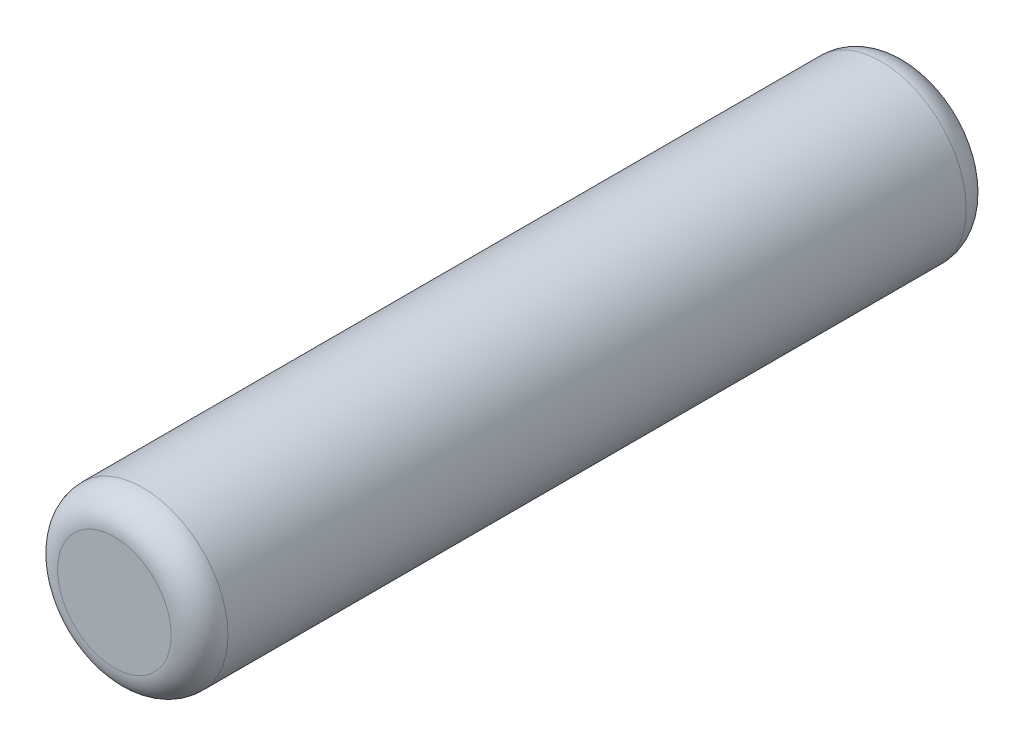
ISO-10303-21;
HEADER;
FILE_DESCRIPTION(('STEP AP214'),'2;1');
FILE_NAME('part.step','',(''),(''),'','','');
FILE_SCHEMA(('AUTOMOTIVE_DESIGN { 1 0 10303 214 1 1 1 1 }'));
ENDSEC;
DATA;
#1=APPLICATION_CONTEXT('core data for automotive mechanical design processes');
#2=APPLICATION_PROTOCOL_DEFINITION('international standard','automotive_design',2000,#1);
#3=PRODUCT_CONTEXT('',#1,'mechanical');
#4=PRODUCT('Part','Part','',(#3));
#5=PRODUCT_RELATED_PRODUCT_CATEGORY('part','',(#4));
#6=PRODUCT_DEFINITION_FORMATION('','',#4);
#7=PRODUCT_DEFINITION_CONTEXT('part definition',#1,'design');
#8=PRODUCT_DEFINITION('design','',#6,#7);
#9=PRODUCT_DEFINITION_SHAPE('','',#8);
#10=(LENGTH_UNIT() NAMED_UNIT(*) SI_UNIT(.MILLI.,.METRE.));
#11=(NAMED_UNIT(*) PLANE_ANGLE_UNIT() SI_UNIT($,.RADIAN.));
#12=(NAMED_UNIT(*) SI_UNIT($,.STERADIAN.) SOLID_ANGLE_UNIT());
#13=UNCERTAINTY_MEASURE_WITH_UNIT(LENGTH_MEASURE(1.E-05),#10,'distance_accuracy_value','');
#14=(GEOMETRIC_REPRESENTATION_CONTEXT(3) GLOBAL_UNCERTAINTY_ASSIGNED_CONTEXT((#13)) GLOBAL_UNIT_ASSIGNED_CONTEXT((#10,
#11,#12)) REPRESENTATION_CONTEXT('',''));
#15=CARTESIAN_POINT('',(0.,0.,0.));
#16=DIRECTION('',(0.,0.,1.));
#17=DIRECTION('',(1.,0.,0.));
#18=AXIS2_PLACEMENT_3D('',#15,#16,#17);
#19=CARTESIAN_POINT('',(0.,0.,28.));
#20=DIRECTION('',(0.,0.,-1.));
#21=DIRECTION('',(-1.,0.,0.));
#22=AXIS2_PLACEMENT_3D('',#19,#20,#21);
#23=CYLINDRICAL_SURFACE('',#22,3.);
#24=CARTESIAN_POINT('',(0.,0.,1.));
#25=DIRECTION('',(0.,0.,1.));
#26=DIRECTION('',(1.,0.,0.));
#27=AXIS2_PLACEMENT_3D('',#24,#25,#26);
#28=CIRCLE('',#27,3.);
#29=CARTESIAN_POINT('',(3.,0.,1.));
#30=VERTEX_POINT('',#29);
#31=EDGE_CURVE('E45',#30,#30,#28,.T.);
#32=ORIENTED_EDGE('',*,*,#31,.T.);
#33=EDGE_LOOP('',(#32));
#34=FACE_BOUND('',#33,.T.);
#35=CARTESIAN_POINT('',(0.,0.,27.));
#36=DIRECTION('',(0.,0.,1.));
#37=DIRECTION('',(1.,0.,0.));
#38=AXIS2_PLACEMENT_3D('',#35,#36,#37);
#39=CIRCLE('',#38,3.);
#40=CARTESIAN_POINT('',(3.,0.,27.));
#41=VERTEX_POINT('',#40);
#42=EDGE_CURVE('E49',#41,#41,#39,.F.);
#43=ORIENTED_EDGE('',*,*,#42,.T.);
#44=EDGE_LOOP('',(#43));
#45=FACE_BOUND('',#44,.T.);
#46=ADVANCED_FACE('F34',(#34,#45),#23,.T.);
#47=CARTESIAN_POINT('',(0.,0.,28.));
#48=DIRECTION('',(0.,0.,1.));
#49=DIRECTION('',(1.,0.,0.));
#50=AXIS2_PLACEMENT_3D('',#47,#48,#49);
#51=PLANE('',#50);
#52=CARTESIAN_POINT('',(0.,0.,28.));
#53=DIRECTION('',(0.,0.,1.));
#54=DIRECTION('',(1.,0.,0.));
#55=AXIS2_PLACEMENT_3D('',#52,#53,#54);
#56=CIRCLE('',#55,2.);
#57=CARTESIAN_POINT('',(2.,0.,28.));
#58=VERTEX_POINT('',#57);
#59=EDGE_CURVE('E10',#58,#58,#56,.T.);
#60=ORIENTED_EDGE('',*,*,#59,.T.);
#61=EDGE_LOOP('',(#60));
#62=FACE_BOUND('',#61,.T.);
#63=ADVANCED_FACE('F65',(#62),#51,.T.);
#64=CARTESIAN_POINT('',(0.,0.,0.));
#65=DIRECTION('',(0.,0.,1.));
#66=DIRECTION('',(1.,0.,0.));
#67=AXIS2_PLACEMENT_3D('',#64,#65,#66);
#68=PLANE('',#67);
#69=CARTESIAN_POINT('',(0.,0.,0.));
#70=DIRECTION('',(0.,0.,1.));
#71=DIRECTION('',(1.,0.,0.));
#72=AXIS2_PLACEMENT_3D('',#69,#70,#71);
#73=CIRCLE('',#72,2.);
#74=CARTESIAN_POINT('',(2.,0.,0.));
#75=VERTEX_POINT('',#74);
#76=EDGE_CURVE('E41',#75,#75,#73,.F.);
#77=ORIENTED_EDGE('',*,*,#76,.T.);
#78=EDGE_LOOP('',(#77));
#79=FACE_BOUND('',#78,.T.);
#80=ADVANCED_FACE('F62',(#79),#68,.F.);
#81=CARTESIAN_POINT('',(0.,0.,1.));
#82=DIRECTION('',(0.,0.,1.));
#83=DIRECTION('',(1.,0.,0.));
#84=AXIS2_PLACEMENT_3D('',#81,#82,#83);
#85=TOROIDAL_SURFACE('',#84,2.,1.);
#86=ORIENTED_EDGE('',*,*,#76,.F.);
#87=EDGE_LOOP('',(#86));
#88=FACE_BOUND('',#87,.T.);
#89=ORIENTED_EDGE('',*,*,#31,.F.);
#90=EDGE_LOOP('',(#89));
#91=FACE_BOUND('',#90,.T.);
#92=ADVANCED_FACE('F58',(#88,#91),#85,.T.);
#93=CARTESIAN_POINT('',(0.,0.,27.));
#94=DIRECTION('',(0.,0.,1.));
#95=DIRECTION('',(1.,0.,0.));
#96=AXIS2_PLACEMENT_3D('',#93,#94,#95);
#97=TOROIDAL_SURFACE('',#96,2.,1.);
#98=ORIENTED_EDGE('',*,*,#42,.F.);
#99=EDGE_LOOP('',(#98));
#100=FACE_BOUND('',#99,.T.);
#101=ORIENTED_EDGE('',*,*,#59,.F.);
#102=EDGE_LOOP('',(#101));
#103=FACE_BOUND('',#102,.T.);
#104=ADVANCED_FACE('F36',(#100,#103),#97,.T.);
#105=CLOSED_SHELL('',(#46,#63,#80,#92,#104));
#106=MANIFOLD_SOLID_BREP('B2',#105);
#107=ADVANCED_BREP_SHAPE_REPRESENTATION('',(#18,#106),#14);
#108=SHAPE_DEFINITION_REPRESENTATION(#9,#107);
ENDSEC;
END-ISO-10303-21;
